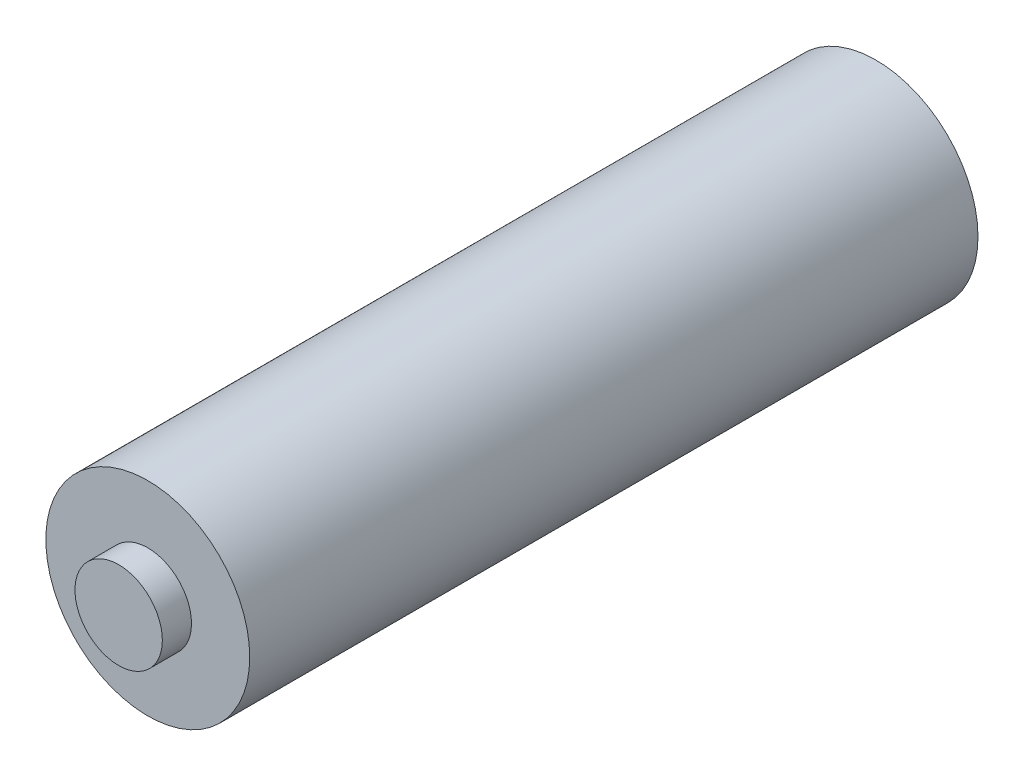
ISO-10303-21;
HEADER;
FILE_DESCRIPTION(('STEP AP214'),'2;1');
FILE_NAME('part.step','',(''),(''),'','','');
FILE_SCHEMA(('AUTOMOTIVE_DESIGN { 1 0 10303 214 1 1 1 1 }'));
ENDSEC;
DATA;
#1=APPLICATION_CONTEXT('core data for automotive mechanical design processes');
#2=APPLICATION_PROTOCOL_DEFINITION('international standard','automotive_design',2000,#1);
#3=PRODUCT_CONTEXT('',#1,'mechanical');
#4=PRODUCT('Part','Part','',(#3));
#5=PRODUCT_RELATED_PRODUCT_CATEGORY('part','',(#4));
#6=PRODUCT_DEFINITION_FORMATION('','',#4);
#7=PRODUCT_DEFINITION_CONTEXT('part definition',#1,'design');
#8=PRODUCT_DEFINITION('design','',#6,#7);
#9=PRODUCT_DEFINITION_SHAPE('','',#8);
#10=(LENGTH_UNIT() NAMED_UNIT(*) SI_UNIT(.MILLI.,.METRE.));
#11=(NAMED_UNIT(*) PLANE_ANGLE_UNIT() SI_UNIT($,.RADIAN.));
#12=(NAMED_UNIT(*) SI_UNIT($,.STERADIAN.) SOLID_ANGLE_UNIT());
#13=UNCERTAINTY_MEASURE_WITH_UNIT(LENGTH_MEASURE(1.E-05),#10,'distance_accuracy_value','');
#14=(GEOMETRIC_REPRESENTATION_CONTEXT(3) GLOBAL_UNCERTAINTY_ASSIGNED_CONTEXT((#13)) GLOBAL_UNIT_ASSIGNED_CONTEXT((#10,
#11,#12)) REPRESENTATION_CONTEXT('',''));
#15=CARTESIAN_POINT('',(0.,0.,0.));
#16=DIRECTION('',(0.,0.,1.));
#17=DIRECTION('',(1.,0.,0.));
#18=AXIS2_PLACEMENT_3D('',#15,#16,#17);
#19=CARTESIAN_POINT('',(0.,0.,125.));
#20=DIRECTION('',(0.,0.,-1.));
#21=DIRECTION('',(-1.,0.,0.));
#22=AXIS2_PLACEMENT_3D('',#19,#20,#21);
#23=CYLINDRICAL_SURFACE('',#22,17.5);
#24=CARTESIAN_POINT('',(0.,0.,125.));
#25=DIRECTION('',(0.,0.,1.));
#26=DIRECTION('',(1.,0.,0.));
#27=AXIS2_PLACEMENT_3D('',#24,#25,#26);
#28=CIRCLE('',#27,17.5);
#29=CARTESIAN_POINT('',(17.5,0.,125.));
#30=VERTEX_POINT('',#29);
#31=EDGE_CURVE('E51',#30,#30,#28,.T.);
#32=ORIENTED_EDGE('',*,*,#31,.F.);
#33=EDGE_LOOP('',(#32));
#34=FACE_BOUND('',#33,.T.);
#35=CARTESIAN_POINT('',(0.,0.,0.));
#36=DIRECTION('',(0.,0.,1.));
#37=DIRECTION('',(1.,0.,0.));
#38=AXIS2_PLACEMENT_3D('',#35,#36,#37);
#39=CIRCLE('',#38,17.5);
#40=CARTESIAN_POINT('',(17.5,0.,0.));
#41=VERTEX_POINT('',#40);
#42=EDGE_CURVE('E40',#41,#41,#39,.T.);
#43=ORIENTED_EDGE('',*,*,#42,.T.);
#44=EDGE_LOOP('',(#43));
#45=FACE_BOUND('',#44,.T.);
#46=ADVANCED_FACE('F37',(#34,#45),#23,.T.);
#47=CARTESIAN_POINT('',(0.,0.,125.));
#48=DIRECTION('',(0.,0.,1.));
#49=DIRECTION('',(1.,0.,0.));
#50=AXIS2_PLACEMENT_3D('',#47,#48,#49);
#51=PLANE('',#50);
#52=CARTESIAN_POINT('',(0.,0.,125.));
#53=DIRECTION('',(0.,0.,1.));
#54=DIRECTION('',(1.,0.,0.));
#55=AXIS2_PLACEMENT_3D('',#52,#53,#54);
#56=CIRCLE('',#55,7.5);
#57=CARTESIAN_POINT('',(7.5,0.,125.));
#58=VERTEX_POINT('',#57);
#59=EDGE_CURVE('E45',#58,#58,#56,.T.);
#60=ORIENTED_EDGE('',*,*,#59,.F.);
#61=EDGE_LOOP('',(#60));
#62=FACE_BOUND('',#61,.T.);
#63=ORIENTED_EDGE('',*,*,#31,.T.);
#64=EDGE_LOOP('',(#63));
#65=FACE_BOUND('',#64,.T.);
#66=ADVANCED_FACE('F71',(#62,#65),#51,.T.);
#67=CARTESIAN_POINT('',(0.,0.,0.));
#68=DIRECTION('',(0.,0.,1.));
#69=DIRECTION('',(1.,0.,0.));
#70=AXIS2_PLACEMENT_3D('',#67,#68,#69);
#71=PLANE('',#70);
#72=CARTESIAN_POINT('',(0.,0.,0.));
#73=DIRECTION('',(0.,0.,-1.));
#74=DIRECTION('',(-1.,0.,0.));
#75=AXIS2_PLACEMENT_3D('',#72,#73,#74);
#76=CIRCLE('',#75,7.5);
#77=CARTESIAN_POINT('',(-7.5,0.,0.));
#78=VERTEX_POINT('',#77);
#79=EDGE_CURVE('E10',#78,#78,#76,.T.);
#80=ORIENTED_EDGE('',*,*,#79,.F.);
#81=EDGE_LOOP('',(#80));
#82=FACE_BOUND('',#81,.T.);
#83=ORIENTED_EDGE('',*,*,#42,.F.);
#84=EDGE_LOOP('',(#83));
#85=FACE_BOUND('',#84,.T.);
#86=ADVANCED_FACE('F68',(#82,#85),#71,.F.);
#87=CARTESIAN_POINT('',(0.,0.,130.));
#88=DIRECTION('',(0.,0.,-1.));
#89=DIRECTION('',(-1.,0.,0.));
#90=AXIS2_PLACEMENT_3D('',#87,#88,#89);
#91=CYLINDRICAL_SURFACE('',#90,7.5);
#92=CARTESIAN_POINT('',(0.,0.,130.));
#93=DIRECTION('',(0.,0.,1.));
#94=DIRECTION('',(1.,0.,0.));
#95=AXIS2_PLACEMENT_3D('',#92,#93,#94);
#96=CIRCLE('',#95,7.5);
#97=CARTESIAN_POINT('',(7.5,0.,130.));
#98=VERTEX_POINT('',#97);
#99=EDGE_CURVE('E56',#98,#98,#96,.T.);
#100=ORIENTED_EDGE('',*,*,#99,.F.);
#101=EDGE_LOOP('',(#100));
#102=FACE_BOUND('',#101,.T.);
#103=ORIENTED_EDGE('',*,*,#59,.T.);
#104=EDGE_LOOP('',(#103));
#105=FACE_BOUND('',#104,.T.);
#106=ADVANCED_FACE('F70',(#102,#105),#91,.T.);
#107=CARTESIAN_POINT('',(0.,0.,130.));
#108=DIRECTION('',(0.,0.,1.));
#109=DIRECTION('',(1.,0.,0.));
#110=AXIS2_PLACEMENT_3D('',#107,#108,#109);
#111=PLANE('',#110);
#112=ORIENTED_EDGE('',*,*,#99,.T.);
#113=EDGE_LOOP('',(#112));
#114=FACE_BOUND('',#113,.T.);
#115=ADVANCED_FACE('F77',(#114),#111,.T.);
#116=CARTESIAN_POINT('',(0.,0.,-5.));
#117=DIRECTION('',(0.,0.,1.));
#118=DIRECTION('',(1.,0.,0.));
#119=AXIS2_PLACEMENT_3D('',#116,#117,#118);
#120=CYLINDRICAL_SURFACE('',#119,7.5);
#121=CARTESIAN_POINT('',(0.,0.,-5.));
#122=DIRECTION('',(0.,0.,-1.));
#123=DIRECTION('',(-1.,0.,0.));
#124=AXIS2_PLACEMENT_3D('',#121,#122,#123);
#125=CIRCLE('',#124,7.5);
#126=CARTESIAN_POINT('',(-7.5,0.,-5.));
#127=VERTEX_POINT('',#126);
#128=EDGE_CURVE('E55',#127,#127,#125,.T.);
#129=ORIENTED_EDGE('',*,*,#128,.F.);
#130=EDGE_LOOP('',(#129));
#131=FACE_BOUND('',#130,.T.);
#132=ORIENTED_EDGE('',*,*,#79,.T.);
#133=EDGE_LOOP('',(#132));
#134=FACE_BOUND('',#133,.T.);
#135=ADVANCED_FACE('F105',(#131,#134),#120,.T.);
#136=CARTESIAN_POINT('',(0.,0.,-5.));
#137=DIRECTION('',(0.,0.,-1.));
#138=DIRECTION('',(-1.,0.,0.));
#139=AXIS2_PLACEMENT_3D('',#136,#137,#138);
#140=PLANE('',#139);
#141=ORIENTED_EDGE('',*,*,#128,.T.);
#142=EDGE_LOOP('',(#141));
#143=FACE_BOUND('',#142,.T.);
#144=ADVANCED_FACE('F119',(#143),#140,.T.);
#145=CLOSED_SHELL('',(#46,#66,#86,#106,#115,#135,#144));
#146=MANIFOLD_SOLID_BREP('B2',#145);
#147=ADVANCED_BREP_SHAPE_REPRESENTATION('',(#18,#146),#14);
#148=SHAPE_DEFINITION_REPRESENTATION(#9,#147);
ENDSEC;
END-ISO-10303-21;
